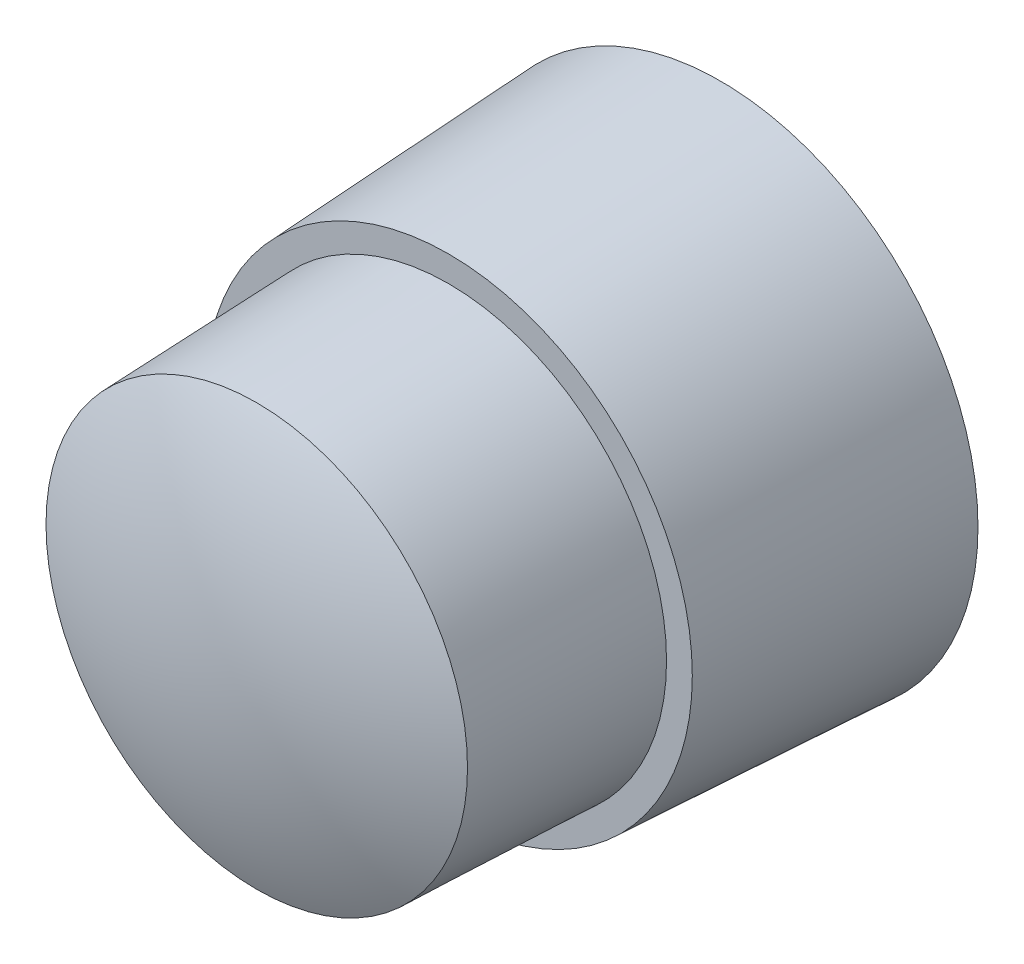
ISO-10303-21;
HEADER;
FILE_DESCRIPTION(('STEP AP214'),'2;1');
FILE_NAME('part.step','',(''),(''),'','','');
FILE_SCHEMA(('AUTOMOTIVE_DESIGN { 1 0 10303 214 1 1 1 1 }'));
ENDSEC;
DATA;
#1=APPLICATION_CONTEXT('core data for automotive mechanical design processes');
#2=APPLICATION_PROTOCOL_DEFINITION('international standard','automotive_design',2000,#1);
#3=PRODUCT_CONTEXT('',#1,'mechanical');
#4=PRODUCT('Part','Part','',(#3));
#5=PRODUCT_RELATED_PRODUCT_CATEGORY('part','',(#4));
#6=PRODUCT_DEFINITION_FORMATION('','',#4);
#7=PRODUCT_DEFINITION_CONTEXT('part definition',#1,'design');
#8=PRODUCT_DEFINITION('design','',#6,#7);
#9=PRODUCT_DEFINITION_SHAPE('','',#8);
#10=(LENGTH_UNIT() NAMED_UNIT(*) SI_UNIT(.MILLI.,.METRE.));
#11=(NAMED_UNIT(*) PLANE_ANGLE_UNIT() SI_UNIT($,.RADIAN.));
#12=(NAMED_UNIT(*) SI_UNIT($,.STERADIAN.) SOLID_ANGLE_UNIT());
#13=UNCERTAINTY_MEASURE_WITH_UNIT(LENGTH_MEASURE(1.E-05),#10,'distance_accuracy_value','');
#14=(GEOMETRIC_REPRESENTATION_CONTEXT(3) GLOBAL_UNCERTAINTY_ASSIGNED_CONTEXT((#13)) GLOBAL_UNIT_ASSIGNED_CONTEXT((#10,
#11,#12)) REPRESENTATION_CONTEXT('',''));
#15=CARTESIAN_POINT('',(0.,0.,0.));
#16=DIRECTION('',(0.,0.,1.));
#17=DIRECTION('',(1.,0.,0.));
#18=AXIS2_PLACEMENT_3D('',#15,#16,#17);
#19=CARTESIAN_POINT('',(0.,0.,0.));
#20=DIRECTION('',(0.,0.,1.));
#21=DIRECTION('',(1.,0.,0.));
#22=AXIS2_PLACEMENT_3D('',#19,#20,#21);
#23=PLANE('',#22);
#24=CARTESIAN_POINT('',(2.54,0.0484716689980266,0.));
#25=DIRECTION('',(0.,0.,1.));
#26=DIRECTION('',(1.,0.,0.));
#27=AXIS2_PLACEMENT_3D('',#24,#25,#26);
#28=CIRCLE('',#27,0.225);
#29=CARTESIAN_POINT('',(2.765,0.0484716689980266,0.));
#30=VERTEX_POINT('',#29);
#31=EDGE_CURVE('E10',#30,#30,#28,.F.);
#32=ORIENTED_EDGE('',*,*,#31,.F.);
#33=EDGE_LOOP('',(#32));
#34=FACE_BOUND('',#33,.T.);
#35=CARTESIAN_POINT('',(0.,-2.49152833100197,0.));
#36=DIRECTION('',(0.,0.,1.));
#37=DIRECTION('',(1.,0.,0.));
#38=AXIS2_PLACEMENT_3D('',#35,#36,#37);
#39=CIRCLE('',#38,0.225);
#40=CARTESIAN_POINT('',(0.225,-2.49152833100197,0.));
#41=VERTEX_POINT('',#40);
#42=EDGE_CURVE('E37',#41,#41,#39,.F.);
#43=ORIENTED_EDGE('',*,*,#42,.F.);
#44=EDGE_LOOP('',(#43));
#45=FACE_BOUND('',#44,.T.);
#46=CARTESIAN_POINT('',(-2.54,0.0484716689980266,0.));
#47=DIRECTION('',(0.,0.,1.));
#48=DIRECTION('',(1.,0.,0.));
#49=AXIS2_PLACEMENT_3D('',#46,#47,#48);
#50=CIRCLE('',#49,0.225);
#51=CARTESIAN_POINT('',(-2.315,0.0484716689980266,0.));
#52=VERTEX_POINT('',#51);
#53=EDGE_CURVE('E41',#52,#52,#50,.F.);
#54=ORIENTED_EDGE('',*,*,#53,.F.);
#55=EDGE_LOOP('',(#54));
#56=FACE_BOUND('',#55,.T.);
#57=CARTESIAN_POINT('',(0.,0.,0.));
#58=DIRECTION('',(0.,0.,1.));
#59=DIRECTION('',(1.,0.,0.));
#60=AXIS2_PLACEMENT_3D('',#57,#58,#59);
#61=CIRCLE('',#60,5.5);
#62=CARTESIAN_POINT('',(5.5,0.,0.));
#63=VERTEX_POINT('',#62);
#64=EDGE_CURVE('E48',#63,#63,#61,.T.);
#65=ORIENTED_EDGE('',*,*,#64,.F.);
#66=EDGE_LOOP('',(#65));
#67=FACE_BOUND('',#66,.T.);
#68=ADVANCED_FACE('F31',(#34,#45,#56,#67),#23,.F.);
#69=CARTESIAN_POINT('',(0.,0.,0.));
#70=DIRECTION('',(0.,0.,-1.));
#71=DIRECTION('',(-1.,0.,0.));
#72=AXIS2_PLACEMENT_3D('',#69,#70,#71);
#73=CONICAL_SURFACE('',#72,5.5,0.05167808448243);
#74=CARTESIAN_POINT('',(0.,0.,5.8));
#75=DIRECTION('',(0.,0.,1.));
#76=DIRECTION('',(1.,0.,0.));
#77=AXIS2_PLACEMENT_3D('',#74,#75,#76);
#78=CIRCLE('',#77,5.2);
#79=CARTESIAN_POINT('',(5.2,0.,5.8));
#80=VERTEX_POINT('',#79);
#81=EDGE_CURVE('E51',#80,#80,#78,.T.);
#82=ORIENTED_EDGE('',*,*,#81,.F.);
#83=EDGE_LOOP('',(#82));
#84=FACE_BOUND('',#83,.T.);
#85=ORIENTED_EDGE('',*,*,#64,.T.);
#86=EDGE_LOOP('',(#85));
#87=FACE_BOUND('',#86,.T.);
#88=ADVANCED_FACE('F84',(#84,#87),#73,.T.);
#89=CARTESIAN_POINT('',(0.,5.2,5.8));
#90=DIRECTION('',(0.,0.,-1.));
#91=DIRECTION('',(-1.,0.,0.));
#92=AXIS2_PLACEMENT_3D('',#89,#90,#91);
#93=PLANE('',#92);
#94=CARTESIAN_POINT('',(0.,0.,5.8));
#95=DIRECTION('',(0.,0.,1.));
#96=DIRECTION('',(0.,-1.,0.));
#97=AXIS2_PLACEMENT_3D('',#94,#95,#96);
#98=CIRCLE('',#97,4.65);
#99=CARTESIAN_POINT('',(0.,-4.65,5.8));
#100=VERTEX_POINT('',#99);
#101=EDGE_CURVE('E45',#100,#100,#98,.T.);
#102=ORIENTED_EDGE('',*,*,#101,.F.);
#103=EDGE_LOOP('',(#102));
#104=FACE_BOUND('',#103,.T.);
#105=ORIENTED_EDGE('',*,*,#81,.T.);
#106=EDGE_LOOP('',(#105));
#107=FACE_BOUND('',#106,.T.);
#108=ADVANCED_FACE('F89',(#104,#107),#93,.F.);
#109=CARTESIAN_POINT('',(0.,0.,5.8));
#110=DIRECTION('',(0.,0.,-1.));
#111=DIRECTION('',(0.,1.,0.));
#112=AXIS2_PLACEMENT_3D('',#109,#110,#111);
#113=CONICAL_SURFACE('',#112,4.65,0.0365690559135416);
#114=CARTESIAN_POINT('',(0.,0.,9.9));
#115=DIRECTION('',(0.,0.,1.));
#116=DIRECTION('',(0.,-1.,0.));
#117=AXIS2_PLACEMENT_3D('',#114,#115,#116);
#118=CIRCLE('',#117,4.5);
#119=CARTESIAN_POINT('',(0.,-4.5,9.9));
#120=VERTEX_POINT('',#119);
#121=EDGE_CURVE('E54',#120,#120,#118,.T.);
#122=ORIENTED_EDGE('',*,*,#121,.F.);
#123=EDGE_LOOP('',(#122));
#124=FACE_BOUND('',#123,.T.);
#125=ORIENTED_EDGE('',*,*,#101,.T.);
#126=EDGE_LOOP('',(#125));
#127=FACE_BOUND('',#126,.T.);
#128=ADVANCED_FACE('F110',(#124,#127),#113,.T.);
#129=CARTESIAN_POINT('',(0.,0.,0.275000000000001));
#130=DIRECTION('',(0.,0.,-1.));
#131=DIRECTION('',(0.,1.,0.));
#132=AXIS2_PLACEMENT_3D('',#129,#130,#131);
#133=SPHERICAL_SURFACE('',#132,10.625);
#134=ORIENTED_EDGE('',*,*,#121,.T.);
#135=EDGE_LOOP('',(#134));
#136=FACE_BOUND('',#135,.T.);
#137=ADVANCED_FACE('F101',(#136),#133,.T.);
#138=CARTESIAN_POINT('',(-2.54,0.0484716689980266,-2.));
#139=DIRECTION('',(0.,0.,1.));
#140=DIRECTION('',(1.,0.,0.));
#141=AXIS2_PLACEMENT_3D('',#138,#139,#140);
#142=CYLINDRICAL_SURFACE('',#141,0.225);
#143=CARTESIAN_POINT('',(-2.54,0.0484716689980266,-2.));
#144=DIRECTION('',(0.,0.,-1.));
#145=DIRECTION('',(-1.,0.,0.));
#146=AXIS2_PLACEMENT_3D('',#143,#144,#145);
#147=CIRCLE('',#146,0.225);
#148=CARTESIAN_POINT('',(-2.765,0.0484716689980266,-2.));
#149=VERTEX_POINT('',#148);
#150=EDGE_CURVE('E57',#149,#149,#147,.T.);
#151=ORIENTED_EDGE('',*,*,#150,.F.);
#152=EDGE_LOOP('',(#151));
#153=FACE_BOUND('',#152,.T.);
#154=ORIENTED_EDGE('',*,*,#53,.T.);
#155=EDGE_LOOP('',(#154));
#156=FACE_BOUND('',#155,.T.);
#157=ADVANCED_FACE('F98',(#153,#156),#142,.T.);
#158=CARTESIAN_POINT('',(-2.54,0.0484716689980266,-2.));
#159=DIRECTION('',(0.,0.,-1.));
#160=DIRECTION('',(-1.,0.,0.));
#161=AXIS2_PLACEMENT_3D('',#158,#159,#160);
#162=PLANE('',#161);
#163=ORIENTED_EDGE('',*,*,#150,.T.);
#164=EDGE_LOOP('',(#163));
#165=FACE_BOUND('',#164,.T.);
#166=ADVANCED_FACE('F100',(#165),#162,.T.);
#167=CARTESIAN_POINT('',(0.,-2.49152833100197,-2.));
#168=DIRECTION('',(0.,0.,1.));
#169=DIRECTION('',(1.,0.,0.));
#170=AXIS2_PLACEMENT_3D('',#167,#168,#169);
#171=CYLINDRICAL_SURFACE('',#170,0.225);
#172=CARTESIAN_POINT('',(0.,-2.49152833100197,-2.));
#173=DIRECTION('',(0.,0.,-1.));
#174=DIRECTION('',(-1.,0.,0.));
#175=AXIS2_PLACEMENT_3D('',#172,#173,#174);
#176=CIRCLE('',#175,0.225);
#177=CARTESIAN_POINT('',(-0.225,-2.49152833100197,-2.));
#178=VERTEX_POINT('',#177);
#179=EDGE_CURVE('E62',#178,#178,#176,.T.);
#180=ORIENTED_EDGE('',*,*,#179,.F.);
#181=EDGE_LOOP('',(#180));
#182=FACE_BOUND('',#181,.T.);
#183=ORIENTED_EDGE('',*,*,#42,.T.);
#184=EDGE_LOOP('',(#183));
#185=FACE_BOUND('',#184,.T.);
#186=ADVANCED_FACE('F80',(#182,#185),#171,.T.);
#187=CARTESIAN_POINT('',(0.,-2.49152833100197,-2.));
#188=DIRECTION('',(0.,0.,-1.));
#189=DIRECTION('',(-1.,0.,0.));
#190=AXIS2_PLACEMENT_3D('',#187,#188,#189);
#191=PLANE('',#190);
#192=ORIENTED_EDGE('',*,*,#179,.T.);
#193=EDGE_LOOP('',(#192));
#194=FACE_BOUND('',#193,.T.);
#195=ADVANCED_FACE('F73',(#194),#191,.T.);
#196=CARTESIAN_POINT('',(2.54,0.0484716689980266,-2.));
#197=DIRECTION('',(0.,0.,1.));
#198=DIRECTION('',(1.,0.,0.));
#199=AXIS2_PLACEMENT_3D('',#196,#197,#198);
#200=CYLINDRICAL_SURFACE('',#199,0.225);
#201=CARTESIAN_POINT('',(2.54,0.0484716689980266,-2.));
#202=DIRECTION('',(0.,0.,-1.));
#203=DIRECTION('',(-1.,0.,0.));
#204=AXIS2_PLACEMENT_3D('',#201,#202,#203);
#205=CIRCLE('',#204,0.225);
#206=CARTESIAN_POINT('',(2.315,0.0484716689980266,-2.));
#207=VERTEX_POINT('',#206);
#208=EDGE_CURVE('E65',#207,#207,#205,.T.);
#209=ORIENTED_EDGE('',*,*,#208,.F.);
#210=EDGE_LOOP('',(#209));
#211=FACE_BOUND('',#210,.T.);
#212=ORIENTED_EDGE('',*,*,#31,.T.);
#213=EDGE_LOOP('',(#212));
#214=FACE_BOUND('',#213,.T.);
#215=ADVANCED_FACE('F71',(#211,#214),#200,.T.);
#216=CARTESIAN_POINT('',(2.54,0.0484716689980266,-2.));
#217=DIRECTION('',(0.,0.,-1.));
#218=DIRECTION('',(-1.,0.,0.));
#219=AXIS2_PLACEMENT_3D('',#216,#217,#218);
#220=PLANE('',#219);
#221=ORIENTED_EDGE('',*,*,#208,.T.);
#222=EDGE_LOOP('',(#221));
#223=FACE_BOUND('',#222,.T.);
#224=ADVANCED_FACE('F69',(#223),#220,.T.);
#225=CLOSED_SHELL('',(#68,#88,#108,#128,#137,#157,#166,#186,#195,#215,#224));
#226=MANIFOLD_SOLID_BREP('B2',#225);
#227=ADVANCED_BREP_SHAPE_REPRESENTATION('',(#18,#226),#14);
#228=SHAPE_DEFINITION_REPRESENTATION(#9,#227);
ENDSEC;
END-ISO-10303-21;
